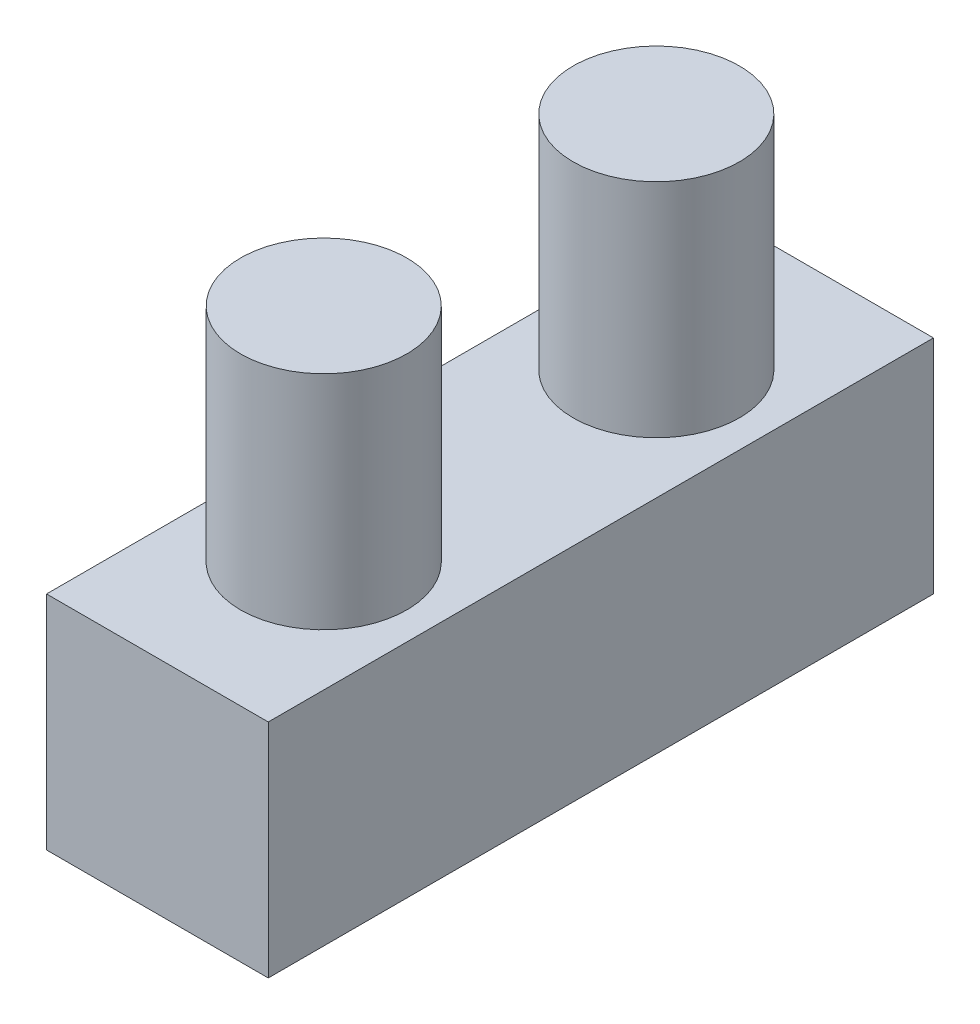
ISO-10303-21;
HEADER;
FILE_DESCRIPTION(('STEP AP214'),'2;1');
FILE_NAME('part.step','',(''),(''),'','','');
FILE_SCHEMA(('AUTOMOTIVE_DESIGN { 1 0 10303 214 1 1 1 1 }'));
ENDSEC;
DATA;
#1=APPLICATION_CONTEXT('core data for automotive mechanical design processes');
#2=APPLICATION_PROTOCOL_DEFINITION('international standard','automotive_design',2000,#1);
#3=PRODUCT_CONTEXT('',#1,'mechanical');
#4=PRODUCT('Part','Part','',(#3));
#5=PRODUCT_RELATED_PRODUCT_CATEGORY('part','',(#4));
#6=PRODUCT_DEFINITION_FORMATION('','',#4);
#7=PRODUCT_DEFINITION_CONTEXT('part definition',#1,'design');
#8=PRODUCT_DEFINITION('design','',#6,#7);
#9=PRODUCT_DEFINITION_SHAPE('','',#8);
#10=(LENGTH_UNIT() NAMED_UNIT(*) SI_UNIT(.MILLI.,.METRE.));
#11=(NAMED_UNIT(*) PLANE_ANGLE_UNIT() SI_UNIT($,.RADIAN.));
#12=(NAMED_UNIT(*) SI_UNIT($,.STERADIAN.) SOLID_ANGLE_UNIT());
#13=UNCERTAINTY_MEASURE_WITH_UNIT(LENGTH_MEASURE(1.E-05),#10,'distance_accuracy_value','');
#14=(GEOMETRIC_REPRESENTATION_CONTEXT(3) GLOBAL_UNCERTAINTY_ASSIGNED_CONTEXT((#13)) GLOBAL_UNIT_ASSIGNED_CONTEXT((#10,
#11,#12)) REPRESENTATION_CONTEXT('',''));
#15=CARTESIAN_POINT('',(0.,0.,0.));
#16=DIRECTION('',(0.,0.,1.));
#17=DIRECTION('',(1.,0.,0.));
#18=AXIS2_PLACEMENT_3D('',#15,#16,#17);
#19=CARTESIAN_POINT('',(0.,2.,0.));
#20=DIRECTION('',(1.,0.,0.));
#21=DIRECTION('',(0.,0.,-1.));
#22=AXIS2_PLACEMENT_3D('',#19,#20,#21);
#23=PLANE('',#22);
#24=DIRECTION('',(0.,0.,1.));
#25=VECTOR('',#24,1.);
#26=CARTESIAN_POINT('',(0.,0.,0.));
#27=LINE('',#26,#25);
#28=CARTESIAN_POINT('',(0.,0.,0.));
#29=VERTEX_POINT('',#28);
#30=CARTESIAN_POINT('',(0.,0.,6.));
#31=VERTEX_POINT('',#30);
#32=EDGE_CURVE('E100',#29,#31,#27,.T.);
#33=ORIENTED_EDGE('',*,*,#32,.T.);
#34=DIRECTION('',(0.,-1.,0.));
#35=VECTOR('',#34,1.);
#36=CARTESIAN_POINT('',(0.,2.,6.));
#37=LINE('',#36,#35);
#38=CARTESIAN_POINT('',(0.,2.,6.));
#39=VERTEX_POINT('',#38);
#40=EDGE_CURVE('E12',#39,#31,#37,.T.);
#41=ORIENTED_EDGE('',*,*,#40,.F.);
#42=DIRECTION('',(0.,0.,1.));
#43=VECTOR('',#42,1.);
#44=CARTESIAN_POINT('',(0.,2.,0.));
#45=LINE('',#44,#43);
#46=CARTESIAN_POINT('',(0.,2.,0.));
#47=VERTEX_POINT('',#46);
#48=EDGE_CURVE('E88',#47,#39,#45,.T.);
#49=ORIENTED_EDGE('',*,*,#48,.F.);
#50=DIRECTION('',(0.,-1.,0.));
#51=VECTOR('',#50,1.);
#52=CARTESIAN_POINT('',(0.,2.,0.));
#53=LINE('',#52,#51);
#54=EDGE_CURVE('E96',#47,#29,#53,.T.);
#55=ORIENTED_EDGE('',*,*,#54,.T.);
#56=EDGE_LOOP('',(#33,#41,#49,#55));
#57=FACE_BOUND('',#56,.T.);
#58=ADVANCED_FACE('F37',(#57),#23,.F.);
#59=CARTESIAN_POINT('',(0.,2.,6.));
#60=DIRECTION('',(0.,0.,-1.));
#61=DIRECTION('',(-1.,0.,0.));
#62=AXIS2_PLACEMENT_3D('',#59,#60,#61);
#63=PLANE('',#62);
#64=DIRECTION('',(1.,0.,0.));
#65=VECTOR('',#64,1.);
#66=CARTESIAN_POINT('',(0.,0.,6.));
#67=LINE('',#66,#65);
#68=CARTESIAN_POINT('',(2.,0.,6.));
#69=VERTEX_POINT('',#68);
#70=EDGE_CURVE('E92',#31,#69,#67,.T.);
#71=ORIENTED_EDGE('',*,*,#70,.T.);
#72=DIRECTION('',(0.,-1.,0.));
#73=VECTOR('',#72,1.);
#74=CARTESIAN_POINT('',(2.,2.,6.));
#75=LINE('',#74,#73);
#76=CARTESIAN_POINT('',(2.,2.,6.));
#77=VERTEX_POINT('',#76);
#78=EDGE_CURVE('E45',#77,#69,#75,.T.);
#79=ORIENTED_EDGE('',*,*,#78,.F.);
#80=DIRECTION('',(1.,0.,0.));
#81=VECTOR('',#80,1.);
#82=CARTESIAN_POINT('',(0.,2.,6.));
#83=LINE('',#82,#81);
#84=EDGE_CURVE('E83',#39,#77,#83,.T.);
#85=ORIENTED_EDGE('',*,*,#84,.F.);
#86=ORIENTED_EDGE('',*,*,#40,.T.);
#87=EDGE_LOOP('',(#71,#79,#85,#86));
#88=FACE_BOUND('',#87,.T.);
#89=ADVANCED_FACE('F91',(#88),#63,.F.);
#90=CARTESIAN_POINT('',(2.,2.,0.));
#91=DIRECTION('',(-1.,0.,0.));
#92=DIRECTION('',(0.,0.,1.));
#93=AXIS2_PLACEMENT_3D('',#90,#91,#92);
#94=PLANE('',#93);
#95=DIRECTION('',(0.,0.,-1.));
#96=VECTOR('',#95,1.);
#97=CARTESIAN_POINT('',(2.,0.,0.));
#98=LINE('',#97,#96);
#99=CARTESIAN_POINT('',(2.,0.,0.));
#100=VERTEX_POINT('',#99);
#101=EDGE_CURVE('E70',#69,#100,#98,.T.);
#102=ORIENTED_EDGE('',*,*,#101,.T.);
#103=DIRECTION('',(0.,-1.,0.));
#104=VECTOR('',#103,1.);
#105=CARTESIAN_POINT('',(2.,2.,0.));
#106=LINE('',#105,#104);
#107=CARTESIAN_POINT('',(2.,2.,0.));
#108=VERTEX_POINT('',#107);
#109=EDGE_CURVE('E93',#108,#100,#106,.T.);
#110=ORIENTED_EDGE('',*,*,#109,.F.);
#111=DIRECTION('',(0.,0.,-1.));
#112=VECTOR('',#111,1.);
#113=CARTESIAN_POINT('',(2.,2.,0.));
#114=LINE('',#113,#112);
#115=EDGE_CURVE('E86',#77,#108,#114,.T.);
#116=ORIENTED_EDGE('',*,*,#115,.F.);
#117=ORIENTED_EDGE('',*,*,#78,.T.);
#118=EDGE_LOOP('',(#102,#110,#116,#117));
#119=FACE_BOUND('',#118,.T.);
#120=ADVANCED_FACE('F94',(#119),#94,.F.);
#121=CARTESIAN_POINT('',(0.,2.,0.));
#122=DIRECTION('',(0.,0.,1.));
#123=DIRECTION('',(1.,0.,0.));
#124=AXIS2_PLACEMENT_3D('',#121,#122,#123);
#125=PLANE('',#124);
#126=DIRECTION('',(-1.,0.,0.));
#127=VECTOR('',#126,1.);
#128=CARTESIAN_POINT('',(0.,0.,0.));
#129=LINE('',#128,#127);
#130=EDGE_CURVE('E76',#100,#29,#129,.T.);
#131=ORIENTED_EDGE('',*,*,#130,.T.);
#132=ORIENTED_EDGE('',*,*,#54,.F.);
#133=DIRECTION('',(-1.,0.,0.));
#134=VECTOR('',#133,1.);
#135=CARTESIAN_POINT('',(0.,2.,0.));
#136=LINE('',#135,#134);
#137=EDGE_CURVE('E53',#108,#47,#136,.T.);
#138=ORIENTED_EDGE('',*,*,#137,.F.);
#139=ORIENTED_EDGE('',*,*,#109,.T.);
#140=EDGE_LOOP('',(#131,#132,#138,#139));
#141=FACE_BOUND('',#140,.T.);
#142=ADVANCED_FACE('F108',(#141),#125,.F.);
#143=CARTESIAN_POINT('',(0.,2.,0.));
#144=DIRECTION('',(0.,1.,0.));
#145=DIRECTION('',(0.,0.,1.));
#146=AXIS2_PLACEMENT_3D('',#143,#144,#145);
#147=PLANE('',#146);
#148=CARTESIAN_POINT('',(1.,2.,4.5));
#149=DIRECTION('',(0.,1.,0.));
#150=DIRECTION('',(0.,0.,1.));
#151=AXIS2_PLACEMENT_3D('',#148,#149,#150);
#152=CIRCLE('',#151,0.75);
#153=CARTESIAN_POINT('',(1.,2.,5.25));
#154=VERTEX_POINT('',#153);
#155=EDGE_CURVE('E120',#154,#154,#152,.T.);
#156=ORIENTED_EDGE('',*,*,#155,.F.);
#157=EDGE_LOOP('',(#156));
#158=FACE_BOUND('',#157,.T.);
#159=CARTESIAN_POINT('',(1.,2.,1.5));
#160=DIRECTION('',(0.,1.,0.));
#161=DIRECTION('',(0.,0.,1.));
#162=AXIS2_PLACEMENT_3D('',#159,#160,#161);
#163=CIRCLE('',#162,0.75);
#164=CARTESIAN_POINT('',(1.,2.,2.25));
#165=VERTEX_POINT('',#164);
#166=EDGE_CURVE('E114',#165,#165,#163,.T.);
#167=ORIENTED_EDGE('',*,*,#166,.F.);
#168=EDGE_LOOP('',(#167));
#169=FACE_BOUND('',#168,.T.);
#170=ORIENTED_EDGE('',*,*,#48,.T.);
#171=ORIENTED_EDGE('',*,*,#84,.T.);
#172=ORIENTED_EDGE('',*,*,#115,.T.);
#173=ORIENTED_EDGE('',*,*,#137,.T.);
#174=EDGE_LOOP('',(#170,#171,#172,#173));
#175=FACE_BOUND('',#174,.T.);
#176=ADVANCED_FACE('F84',(#158,#169,#175),#147,.T.);
#177=CARTESIAN_POINT('',(0.,0.,0.));
#178=DIRECTION('',(0.,1.,0.));
#179=DIRECTION('',(0.,0.,1.));
#180=AXIS2_PLACEMENT_3D('',#177,#178,#179);
#181=PLANE('',#180);
#182=ORIENTED_EDGE('',*,*,#32,.F.);
#183=ORIENTED_EDGE('',*,*,#130,.F.);
#184=ORIENTED_EDGE('',*,*,#101,.F.);
#185=ORIENTED_EDGE('',*,*,#70,.F.);
#186=EDGE_LOOP('',(#182,#183,#184,#185));
#187=FACE_BOUND('',#186,.T.);
#188=ADVANCED_FACE('F111',(#187),#181,.F.);
#189=CARTESIAN_POINT('',(1.,4.,1.5));
#190=DIRECTION('',(0.,-1.,0.));
#191=DIRECTION('',(0.,0.,-1.));
#192=AXIS2_PLACEMENT_3D('',#189,#190,#191);
#193=CYLINDRICAL_SURFACE('',#192,0.75);
#194=CARTESIAN_POINT('',(1.,4.,1.5));
#195=DIRECTION('',(0.,1.,0.));
#196=DIRECTION('',(0.,0.,1.));
#197=AXIS2_PLACEMENT_3D('',#194,#195,#196);
#198=CIRCLE('',#197,0.75);
#199=CARTESIAN_POINT('',(1.,4.,2.25));
#200=VERTEX_POINT('',#199);
#201=EDGE_CURVE('E103',#200,#200,#198,.T.);
#202=ORIENTED_EDGE('',*,*,#201,.F.);
#203=EDGE_LOOP('',(#202));
#204=FACE_BOUND('',#203,.T.);
#205=ORIENTED_EDGE('',*,*,#166,.T.);
#206=EDGE_LOOP('',(#205));
#207=FACE_BOUND('',#206,.T.);
#208=ADVANCED_FACE('F140',(#204,#207),#193,.T.);
#209=CARTESIAN_POINT('',(1.,4.,1.5));
#210=DIRECTION('',(0.,1.,0.));
#211=DIRECTION('',(0.,0.,1.));
#212=AXIS2_PLACEMENT_3D('',#209,#210,#211);
#213=PLANE('',#212);
#214=ORIENTED_EDGE('',*,*,#201,.T.);
#215=EDGE_LOOP('',(#214));
#216=FACE_BOUND('',#215,.T.);
#217=ADVANCED_FACE('F131',(#216),#213,.T.);
#218=CARTESIAN_POINT('',(1.,4.,4.5));
#219=DIRECTION('',(0.,-1.,0.));
#220=DIRECTION('',(0.,0.,-1.));
#221=AXIS2_PLACEMENT_3D('',#218,#219,#220);
#222=CYLINDRICAL_SURFACE('',#221,0.75);
#223=CARTESIAN_POINT('',(1.,4.,4.5));
#224=DIRECTION('',(0.,1.,0.));
#225=DIRECTION('',(0.,0.,1.));
#226=AXIS2_PLACEMENT_3D('',#223,#224,#225);
#227=CIRCLE('',#226,0.75);
#228=CARTESIAN_POINT('',(1.,4.,5.25));
#229=VERTEX_POINT('',#228);
#230=EDGE_CURVE('E117',#229,#229,#227,.T.);
#231=ORIENTED_EDGE('',*,*,#230,.F.);
#232=EDGE_LOOP('',(#231));
#233=FACE_BOUND('',#232,.T.);
#234=ORIENTED_EDGE('',*,*,#155,.T.);
#235=EDGE_LOOP('',(#234));
#236=FACE_BOUND('',#235,.T.);
#237=ADVANCED_FACE('F128',(#233,#236),#222,.T.);
#238=CARTESIAN_POINT('',(1.,4.,4.5));
#239=DIRECTION('',(0.,1.,0.));
#240=DIRECTION('',(0.,0.,1.));
#241=AXIS2_PLACEMENT_3D('',#238,#239,#240);
#242=PLANE('',#241);
#243=ORIENTED_EDGE('',*,*,#230,.T.);
#244=EDGE_LOOP('',(#243));
#245=FACE_BOUND('',#244,.T.);
#246=ADVANCED_FACE('F126',(#245),#242,.T.);
#247=CLOSED_SHELL('',(#58,#89,#120,#142,#176,#188,#208,#217,#237,#246));
#248=MANIFOLD_SOLID_BREP('B2',#247);
#249=ADVANCED_BREP_SHAPE_REPRESENTATION('',(#18,#248),#14);
#250=SHAPE_DEFINITION_REPRESENTATION(#9,#249);
ENDSEC;
END-ISO-10303-21;
